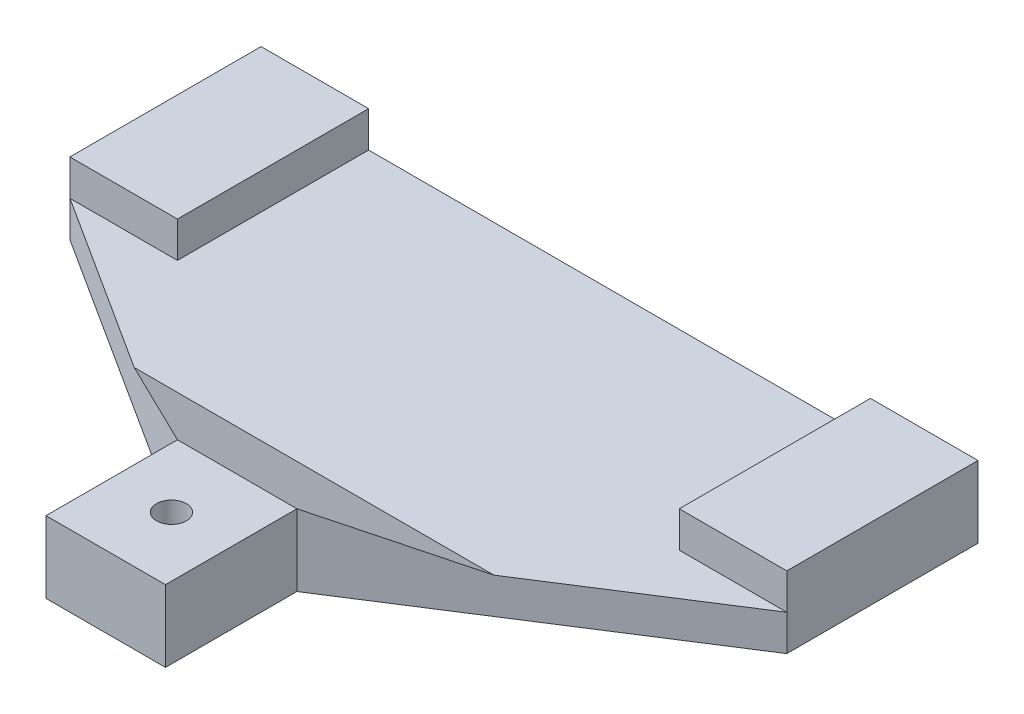
ISO-10303-21;
HEADER;
FILE_DESCRIPTION(('STEP AP214'),'2;1');
FILE_NAME('part.step','',(''),(''),'','','');
FILE_SCHEMA(('AUTOMOTIVE_DESIGN { 1 0 10303 214 1 1 1 1 }'));
ENDSEC;
DATA;
#1=APPLICATION_CONTEXT('core data for automotive mechanical design processes');
#2=APPLICATION_PROTOCOL_DEFINITION('international standard','automotive_design',2000,#1);
#3=PRODUCT_CONTEXT('',#1,'mechanical');
#4=PRODUCT('Part','Part','',(#3));
#5=PRODUCT_RELATED_PRODUCT_CATEGORY('part','',(#4));
#6=PRODUCT_DEFINITION_FORMATION('','',#4);
#7=PRODUCT_DEFINITION_CONTEXT('part definition',#1,'design');
#8=PRODUCT_DEFINITION('design','',#6,#7);
#9=PRODUCT_DEFINITION_SHAPE('','',#8);
#10=(LENGTH_UNIT() NAMED_UNIT(*) SI_UNIT(.MILLI.,.METRE.));
#11=(NAMED_UNIT(*) PLANE_ANGLE_UNIT() SI_UNIT($,.RADIAN.));
#12=(NAMED_UNIT(*) SI_UNIT($,.STERADIAN.) SOLID_ANGLE_UNIT());
#13=UNCERTAINTY_MEASURE_WITH_UNIT(LENGTH_MEASURE(1.E-05),#10,'distance_accuracy_value','');
#14=(GEOMETRIC_REPRESENTATION_CONTEXT(3) GLOBAL_UNCERTAINTY_ASSIGNED_CONTEXT((#13)) GLOBAL_UNIT_ASSIGNED_CONTEXT((#10,
#11,#12)) REPRESENTATION_CONTEXT('',''));
#15=CARTESIAN_POINT('',(0.,0.,0.));
#16=DIRECTION('',(0.,0.,1.));
#17=DIRECTION('',(1.,0.,0.));
#18=AXIS2_PLACEMENT_3D('',#15,#16,#17);
#19=CARTESIAN_POINT('',(0.,6.,60.));
#20=DIRECTION('',(0.,-1.,0.));
#21=DIRECTION('',(0.,0.,-1.));
#22=AXIS2_PLACEMENT_3D('',#19,#20,#21);
#23=PLANE('',#22);
#24=DIRECTION('',(0.,0.,-1.));
#25=VECTOR('',#24,1.);
#26=CARTESIAN_POINT('',(0.,6.,60.));
#27=LINE('',#26,#25);
#28=CARTESIAN_POINT('',(0.,6.,16.));
#29=VERTEX_POINT('',#28);
#30=CARTESIAN_POINT('',(0.,6.,0.));
#31=VERTEX_POINT('',#30);
#32=EDGE_CURVE('E228',#29,#31,#27,.T.);
#33=ORIENTED_EDGE('',*,*,#32,.F.);
#34=DIRECTION('',(-1.,0.,0.));
#35=VECTOR('',#34,1.);
#36=CARTESIAN_POINT('',(0.,6.,16.));
#37=LINE('',#36,#35);
#38=CARTESIAN_POINT('',(9.,6.,16.));
#39=VERTEX_POINT('',#38);
#40=EDGE_CURVE('E164',#39,#29,#37,.T.);
#41=ORIENTED_EDGE('',*,*,#40,.F.);
#42=DIRECTION('',(0.,0.,1.));
#43=VECTOR('',#42,1.);
#44=CARTESIAN_POINT('',(9.,6.,16.));
#45=LINE('',#44,#43);
#46=CARTESIAN_POINT('',(9.,6.,0.));
#47=VERTEX_POINT('',#46);
#48=EDGE_CURVE('E180',#47,#39,#45,.T.);
#49=ORIENTED_EDGE('',*,*,#48,.F.);
#50=DIRECTION('',(-1.,0.,0.));
#51=VECTOR('',#50,1.);
#52=CARTESIAN_POINT('',(0.,6.,0.));
#53=LINE('',#52,#51);
#54=EDGE_CURVE('E224',#47,#31,#53,.T.);
#55=ORIENTED_EDGE('',*,*,#54,.T.);
#56=EDGE_LOOP('',(#33,#41,#49,#55));
#57=FACE_BOUND('',#56,.T.);
#58=ADVANCED_FACE('F33',(#57),#23,.F.);
#59=CARTESIAN_POINT('',(30.,6.,37.5));
#60=DIRECTION('',(0.,1.,0.));
#61=DIRECTION('',(0.,0.,1.));
#62=AXIS2_PLACEMENT_3D('',#59,#60,#61);
#63=CIRCLE('',#62,1.25);
#64=CARTESIAN_POINT('',(30.,6.,38.75));
#65=VERTEX_POINT('',#64);
#66=EDGE_CURVE('E187',#65,#65,#63,.T.);
#67=ORIENTED_EDGE('',*,*,#66,.F.);
#68=EDGE_LOOP('',(#67));
#69=FACE_BOUND('',#68,.T.);
#70=DIRECTION('',(0.,0.,1.));
#71=VECTOR('',#70,1.);
#72=CARTESIAN_POINT('',(25.,6.,32.));
#73=LINE('',#72,#71);
#74=CARTESIAN_POINT('',(25.,5.99999999999999,32.));
#75=VERTEX_POINT('',#74);
#76=CARTESIAN_POINT('',(25.,6.,43.));
#77=VERTEX_POINT('',#76);
#78=EDGE_CURVE('E152',#75,#77,#73,.T.);
#79=ORIENTED_EDGE('',*,*,#78,.T.);
#80=DIRECTION('',(1.,0.,0.));
#81=VECTOR('',#80,1.);
#82=CARTESIAN_POINT('',(25.,6.,43.));
#83=LINE('',#82,#81);
#84=CARTESIAN_POINT('',(35.,6.,43.));
#85=VERTEX_POINT('',#84);
#86=EDGE_CURVE('E137',#77,#85,#83,.T.);
#87=ORIENTED_EDGE('',*,*,#86,.T.);
#88=DIRECTION('',(0.,0.,-1.));
#89=VECTOR('',#88,1.);
#90=CARTESIAN_POINT('',(35.,6.,43.));
#91=LINE('',#90,#89);
#92=CARTESIAN_POINT('',(35.,6.,32.));
#93=VERTEX_POINT('',#92);
#94=EDGE_CURVE('E127',#85,#93,#91,.T.);
#95=ORIENTED_EDGE('',*,*,#94,.T.);
#96=DIRECTION('',(-1.,0.,0.));
#97=VECTOR('',#96,1.);
#98=CARTESIAN_POINT('',(35.,6.,32.));
#99=LINE('',#98,#97);
#100=EDGE_CURVE('E136',#93,#75,#99,.T.);
#101=ORIENTED_EDGE('',*,*,#100,.T.);
#102=EDGE_LOOP('',(#79,#87,#95,#101));
#103=FACE_BOUND('',#102,.T.);
#104=ADVANCED_FACE('F150',(#69,#103),#23,.F.);
#105=CARTESIAN_POINT('',(0.,0.,60.));
#106=DIRECTION('',(1.,0.,0.));
#107=DIRECTION('',(0.,0.,-1.));
#108=AXIS2_PLACEMENT_3D('',#105,#106,#107);
#109=PLANE('',#108);
#110=DIRECTION('',(0.,0.,-1.));
#111=VECTOR('',#110,1.);
#112=CARTESIAN_POINT('',(0.,0.,60.));
#113=LINE('',#112,#111);
#114=CARTESIAN_POINT('',(0.,0.,16.));
#115=VERTEX_POINT('',#114);
#116=CARTESIAN_POINT('',(0.,0.,0.));
#117=VERTEX_POINT('',#116);
#118=EDGE_CURVE('E234',#115,#117,#113,.T.);
#119=ORIENTED_EDGE('',*,*,#118,.F.);
#120=DIRECTION('',(0.,1.,0.));
#121=VECTOR('',#120,1.);
#122=CARTESIAN_POINT('',(0.,-49.,16.));
#123=LINE('',#122,#121);
#124=CARTESIAN_POINT('',(0.,3.,16.));
#125=VERTEX_POINT('',#124);
#126=EDGE_CURVE('E80',#115,#125,#123,.T.);
#127=ORIENTED_EDGE('',*,*,#126,.T.);
#128=DIRECTION('',(0.,1.,0.));
#129=VECTOR('',#128,1.);
#130=CARTESIAN_POINT('',(0.,3.,16.));
#131=LINE('',#130,#129);
#132=EDGE_CURVE('E184',#125,#29,#131,.T.);
#133=ORIENTED_EDGE('',*,*,#132,.T.);
#134=ORIENTED_EDGE('',*,*,#32,.T.);
#135=DIRECTION('',(0.,-1.,0.));
#136=VECTOR('',#135,1.);
#137=CARTESIAN_POINT('',(0.,0.,0.));
#138=LINE('',#137,#136);
#139=EDGE_CURVE('E213',#31,#117,#138,.T.);
#140=ORIENTED_EDGE('',*,*,#139,.T.);
#141=EDGE_LOOP('',(#119,#127,#133,#134,#140));
#142=FACE_BOUND('',#141,.T.);
#143=ADVANCED_FACE('F275',(#142),#109,.F.);
#144=CARTESIAN_POINT('',(0.,0.,60.));
#145=DIRECTION('',(0.,1.,0.));
#146=DIRECTION('',(0.,0.,1.));
#147=AXIS2_PLACEMENT_3D('',#144,#145,#146);
#148=PLANE('',#147);
#149=CARTESIAN_POINT('',(30.,0.,37.5));
#150=DIRECTION('',(0.,1.,0.));
#151=DIRECTION('',(0.,0.,1.));
#152=AXIS2_PLACEMENT_3D('',#149,#150,#151);
#153=CIRCLE('',#152,1.25);
#154=CARTESIAN_POINT('',(30.,0.,38.75));
#155=VERTEX_POINT('',#154);
#156=EDGE_CURVE('E200',#155,#155,#153,.T.);
#157=ORIENTED_EDGE('',*,*,#156,.T.);
#158=EDGE_LOOP('',(#157));
#159=FACE_BOUND('',#158,.T.);
#160=DIRECTION('',(0.,0.,-1.));
#161=VECTOR('',#160,1.);
#162=CARTESIAN_POINT('',(25.,0.,60.));
#163=LINE('',#162,#161);
#164=CARTESIAN_POINT('',(25.,0.,43.));
#165=VERTEX_POINT('',#164);
#166=CARTESIAN_POINT('',(25.,0.,32.));
#167=VERTEX_POINT('',#166);
#168=EDGE_CURVE('E267',#165,#167,#163,.T.);
#169=ORIENTED_EDGE('',*,*,#168,.T.);
#170=DIRECTION('',(-0.842271400661512,0.,-0.539053696423367));
#171=VECTOR('',#170,1.);
#172=CARTESIAN_POINT('',(19.9772985244041,0.,28.7854710556186));
#173=LINE('',#172,#171);
#174=EDGE_CURVE('E154',#167,#115,#173,.T.);
#175=ORIENTED_EDGE('',*,*,#174,.T.);
#176=ORIENTED_EDGE('',*,*,#118,.T.);
#177=DIRECTION('',(1.,0.,0.));
#178=VECTOR('',#177,1.);
#179=CARTESIAN_POINT('',(0.,0.,0.));
#180=LINE('',#179,#178);
#181=CARTESIAN_POINT('',(60.,0.,0.));
#182=VERTEX_POINT('',#181);
#183=EDGE_CURVE('E218',#117,#182,#180,.T.);
#184=ORIENTED_EDGE('',*,*,#183,.T.);
#185=DIRECTION('',(0.,0.,-1.));
#186=VECTOR('',#185,1.);
#187=CARTESIAN_POINT('',(60.,0.,60.));
#188=LINE('',#187,#186);
#189=CARTESIAN_POINT('',(60.,0.,16.));
#190=VERTEX_POINT('',#189);
#191=EDGE_CURVE('E232',#190,#182,#188,.T.);
#192=ORIENTED_EDGE('',*,*,#191,.F.);
#193=DIRECTION('',(-0.842271400661512,0.,0.539053696423367));
#194=VECTOR('',#193,1.);
#195=CARTESIAN_POINT('',(-2.54256526674234,0.,56.0272417707151));
#196=LINE('',#195,#194);
#197=CARTESIAN_POINT('',(35.,0.,32.));
#198=VERTEX_POINT('',#197);
#199=EDGE_CURVE('E259',#190,#198,#196,.T.);
#200=ORIENTED_EDGE('',*,*,#199,.T.);
#201=DIRECTION('',(0.,0.,1.));
#202=VECTOR('',#201,1.);
#203=CARTESIAN_POINT('',(35.,0.,60.));
#204=LINE('',#203,#202);
#205=CARTESIAN_POINT('',(35.,0.,43.));
#206=VERTEX_POINT('',#205);
#207=EDGE_CURVE('E264',#198,#206,#204,.T.);
#208=ORIENTED_EDGE('',*,*,#207,.T.);
#209=DIRECTION('',(-1.,0.,0.));
#210=VECTOR('',#209,1.);
#211=CARTESIAN_POINT('',(0.,0.,43.));
#212=LINE('',#211,#210);
#213=EDGE_CURVE('E145',#206,#165,#212,.T.);
#214=ORIENTED_EDGE('',*,*,#213,.T.);
#215=EDGE_LOOP('',(#169,#175,#176,#184,#192,#200,#208,#214));
#216=FACE_BOUND('',#215,.T.);
#217=ADVANCED_FACE('F271',(#159,#216),#148,.F.);
#218=CARTESIAN_POINT('',(60.,0.,60.));
#219=DIRECTION('',(-1.,0.,0.));
#220=DIRECTION('',(0.,0.,1.));
#221=AXIS2_PLACEMENT_3D('',#218,#219,#220);
#222=PLANE('',#221);
#223=DIRECTION('',(0.,1.,0.));
#224=VECTOR('',#223,1.);
#225=CARTESIAN_POINT('',(60.,3.,16.));
#226=LINE('',#225,#224);
#227=CARTESIAN_POINT('',(60.,3.,16.));
#228=VERTEX_POINT('',#227);
#229=CARTESIAN_POINT('',(60.,6.,16.));
#230=VERTEX_POINT('',#229);
#231=EDGE_CURVE('E175',#228,#230,#226,.T.);
#232=ORIENTED_EDGE('',*,*,#231,.F.);
#233=DIRECTION('',(0.,1.,0.));
#234=VECTOR('',#233,1.);
#235=CARTESIAN_POINT('',(60.,-49.,16.));
#236=LINE('',#235,#234);
#237=EDGE_CURVE('E243',#190,#228,#236,.T.);
#238=ORIENTED_EDGE('',*,*,#237,.F.);
#239=ORIENTED_EDGE('',*,*,#191,.T.);
#240=DIRECTION('',(0.,1.,0.));
#241=VECTOR('',#240,1.);
#242=CARTESIAN_POINT('',(60.,0.,0.));
#243=LINE('',#242,#241);
#244=CARTESIAN_POINT('',(60.,6.,0.));
#245=VERTEX_POINT('',#244);
#246=EDGE_CURVE('E221',#182,#245,#243,.T.);
#247=ORIENTED_EDGE('',*,*,#246,.T.);
#248=DIRECTION('',(0.,0.,-1.));
#249=VECTOR('',#248,1.);
#250=CARTESIAN_POINT('',(60.,6.,60.));
#251=LINE('',#250,#249);
#252=EDGE_CURVE('E230',#230,#245,#251,.T.);
#253=ORIENTED_EDGE('',*,*,#252,.F.);
#254=EDGE_LOOP('',(#232,#238,#239,#247,#253));
#255=FACE_BOUND('',#254,.T.);
#256=ADVANCED_FACE('F292',(#255),#222,.F.);
#257=CARTESIAN_POINT('',(51.,6.,0.));
#258=VERTEX_POINT('',#257);
#259=EDGE_CURVE('E225',#245,#258,#53,.T.);
#260=ORIENTED_EDGE('',*,*,#259,.T.);
#261=DIRECTION('',(0.,0.,-1.));
#262=VECTOR('',#261,1.);
#263=CARTESIAN_POINT('',(51.,6.,0.));
#264=LINE('',#263,#262);
#265=CARTESIAN_POINT('',(51.,6.,16.));
#266=VERTEX_POINT('',#265);
#267=EDGE_CURVE('E178',#266,#258,#264,.T.);
#268=ORIENTED_EDGE('',*,*,#267,.F.);
#269=DIRECTION('',(-1.,0.,0.));
#270=VECTOR('',#269,1.);
#271=CARTESIAN_POINT('',(51.,6.,16.));
#272=LINE('',#271,#270);
#273=EDGE_CURVE('E147',#230,#266,#272,.T.);
#274=ORIENTED_EDGE('',*,*,#273,.F.);
#275=ORIENTED_EDGE('',*,*,#252,.T.);
#276=EDGE_LOOP('',(#260,#268,#274,#275));
#277=FACE_BOUND('',#276,.T.);
#278=ADVANCED_FACE('F300',(#277),#23,.F.);
#279=CARTESIAN_POINT('',(0.,0.,0.));
#280=DIRECTION('',(0.,0.,-1.));
#281=DIRECTION('',(-1.,0.,0.));
#282=AXIS2_PLACEMENT_3D('',#279,#280,#281);
#283=PLANE('',#282);
#284=DIRECTION('',(0.,1.,0.));
#285=VECTOR('',#284,1.);
#286=CARTESIAN_POINT('',(9.,3.,0.));
#287=LINE('',#286,#285);
#288=CARTESIAN_POINT('',(9.,3.,0.));
#289=VERTEX_POINT('',#288);
#290=EDGE_CURVE('E190',#289,#47,#287,.T.);
#291=ORIENTED_EDGE('',*,*,#290,.F.);
#292=DIRECTION('',(-1.,0.,0.));
#293=VECTOR('',#292,1.);
#294=CARTESIAN_POINT('',(9.,3.,0.));
#295=LINE('',#294,#293);
#296=CARTESIAN_POINT('',(51.,3.,0.));
#297=VERTEX_POINT('',#296);
#298=EDGE_CURVE('E166',#297,#289,#295,.T.);
#299=ORIENTED_EDGE('',*,*,#298,.F.);
#300=DIRECTION('',(0.,1.,0.));
#301=VECTOR('',#300,1.);
#302=CARTESIAN_POINT('',(51.,3.,0.));
#303=LINE('',#302,#301);
#304=EDGE_CURVE('E192',#297,#258,#303,.T.);
#305=ORIENTED_EDGE('',*,*,#304,.T.);
#306=ORIENTED_EDGE('',*,*,#259,.F.);
#307=ORIENTED_EDGE('',*,*,#246,.F.);
#308=ORIENTED_EDGE('',*,*,#183,.F.);
#309=ORIENTED_EDGE('',*,*,#139,.F.);
#310=ORIENTED_EDGE('',*,*,#54,.F.);
#311=EDGE_LOOP('',(#291,#299,#305,#306,#307,#308,#309,#310));
#312=FACE_BOUND('',#311,.T.);
#313=CARTESIAN_POINT('',(5.75,3.,0.));
#314=DIRECTION('',(0.,0.,-1.));
#315=DIRECTION('',(-1.,0.,0.));
#316=AXIS2_PLACEMENT_3D('',#313,#314,#315);
#317=CIRCLE('',#316,1.25);
#318=CARTESIAN_POINT('',(4.5,3.,0.));
#319=VERTEX_POINT('',#318);
#320=EDGE_CURVE('E203',#319,#319,#317,.T.);
#321=ORIENTED_EDGE('',*,*,#320,.F.);
#322=EDGE_LOOP('',(#321));
#323=FACE_BOUND('',#322,.T.);
#324=CARTESIAN_POINT('',(54.,3.,0.));
#325=DIRECTION('',(0.,0.,-1.));
#326=DIRECTION('',(-1.,0.,0.));
#327=AXIS2_PLACEMENT_3D('',#324,#325,#326);
#328=CIRCLE('',#327,1.25);
#329=CARTESIAN_POINT('',(52.75,3.,0.));
#330=VERTEX_POINT('',#329);
#331=EDGE_CURVE('E207',#330,#330,#328,.T.);
#332=ORIENTED_EDGE('',*,*,#331,.F.);
#333=EDGE_LOOP('',(#332));
#334=FACE_BOUND('',#333,.T.);
#335=ADVANCED_FACE('F283',(#312,#323,#334),#283,.T.);
#336=CARTESIAN_POINT('',(54.,3.,15.));
#337=DIRECTION('',(0.,0.,-1.));
#338=DIRECTION('',(-1.,0.,0.));
#339=AXIS2_PLACEMENT_3D('',#336,#337,#338);
#340=CYLINDRICAL_SURFACE('',#339,1.25);
#341=CARTESIAN_POINT('',(54.,3.,15.));
#342=DIRECTION('',(0.,0.,-1.));
#343=DIRECTION('',(-1.,0.,0.));
#344=AXIS2_PLACEMENT_3D('',#341,#342,#343);
#345=CIRCLE('',#344,1.25);
#346=CARTESIAN_POINT('',(52.75,3.,15.));
#347=VERTEX_POINT('',#346);
#348=EDGE_CURVE('E210',#347,#347,#345,.T.);
#349=ORIENTED_EDGE('',*,*,#348,.F.);
#350=EDGE_LOOP('',(#349));
#351=FACE_BOUND('',#350,.T.);
#352=ORIENTED_EDGE('',*,*,#331,.T.);
#353=EDGE_LOOP('',(#352));
#354=FACE_BOUND('',#353,.T.);
#355=ADVANCED_FACE('F336',(#351,#354),#340,.F.);
#356=CARTESIAN_POINT('',(54.,3.,15.));
#357=DIRECTION('',(0.,0.,-1.));
#358=DIRECTION('',(-1.,0.,0.));
#359=AXIS2_PLACEMENT_3D('',#356,#357,#358);
#360=PLANE('',#359);
#361=ORIENTED_EDGE('',*,*,#348,.T.);
#362=EDGE_LOOP('',(#361));
#363=FACE_BOUND('',#362,.T.);
#364=ADVANCED_FACE('F482',(#363),#360,.T.);
#365=CARTESIAN_POINT('',(5.75,3.,15.));
#366=DIRECTION('',(0.,0.,-1.));
#367=DIRECTION('',(-1.,0.,0.));
#368=AXIS2_PLACEMENT_3D('',#365,#366,#367);
#369=CYLINDRICAL_SURFACE('',#368,1.25);
#370=CARTESIAN_POINT('',(5.75,3.,15.));
#371=DIRECTION('',(0.,0.,-1.));
#372=DIRECTION('',(-1.,0.,0.));
#373=AXIS2_PLACEMENT_3D('',#370,#371,#372);
#374=CIRCLE('',#373,1.25);
#375=CARTESIAN_POINT('',(4.5,3.,15.));
#376=VERTEX_POINT('',#375);
#377=EDGE_CURVE('E204',#376,#376,#374,.T.);
#378=ORIENTED_EDGE('',*,*,#377,.F.);
#379=EDGE_LOOP('',(#378));
#380=FACE_BOUND('',#379,.T.);
#381=ORIENTED_EDGE('',*,*,#320,.T.);
#382=EDGE_LOOP('',(#381));
#383=FACE_BOUND('',#382,.T.);
#384=ADVANCED_FACE('F489',(#380,#383),#369,.F.);
#385=CARTESIAN_POINT('',(5.75,3.,15.));
#386=DIRECTION('',(0.,0.,-1.));
#387=DIRECTION('',(-1.,0.,0.));
#388=AXIS2_PLACEMENT_3D('',#385,#386,#387);
#389=PLANE('',#388);
#390=ORIENTED_EDGE('',*,*,#377,.T.);
#391=EDGE_LOOP('',(#390));
#392=FACE_BOUND('',#391,.T.);
#393=ADVANCED_FACE('F497',(#392),#389,.T.);
#394=CARTESIAN_POINT('',(30.,-9.,37.5));
#395=DIRECTION('',(0.,1.,0.));
#396=DIRECTION('',(0.,0.,1.));
#397=AXIS2_PLACEMENT_3D('',#394,#395,#396);
#398=CYLINDRICAL_SURFACE('',#397,1.25);
#399=ORIENTED_EDGE('',*,*,#66,.T.);
#400=EDGE_LOOP('',(#399));
#401=FACE_BOUND('',#400,.T.);
#402=ORIENTED_EDGE('',*,*,#156,.F.);
#403=EDGE_LOOP('',(#402));
#404=FACE_BOUND('',#403,.T.);
#405=ADVANCED_FACE('F321',(#401,#404),#398,.F.);
#406=CARTESIAN_POINT('',(0.,3.,16.));
#407=DIRECTION('',(0.,0.,-1.));
#408=DIRECTION('',(-1.,0.,0.));
#409=AXIS2_PLACEMENT_3D('',#406,#407,#408);
#410=PLANE('',#409);
#411=ORIENTED_EDGE('',*,*,#40,.T.);
#412=ORIENTED_EDGE('',*,*,#132,.F.);
#413=DIRECTION('',(-1.,0.,0.));
#414=VECTOR('',#413,1.);
#415=CARTESIAN_POINT('',(0.,3.,16.));
#416=LINE('',#415,#414);
#417=CARTESIAN_POINT('',(9.,3.,16.));
#418=VERTEX_POINT('',#417);
#419=EDGE_CURVE('E172',#418,#125,#416,.T.);
#420=ORIENTED_EDGE('',*,*,#419,.F.);
#421=DIRECTION('',(0.,1.,0.));
#422=VECTOR('',#421,1.);
#423=CARTESIAN_POINT('',(9.,3.,16.));
#424=LINE('',#423,#422);
#425=EDGE_CURVE('E188',#418,#39,#424,.T.);
#426=ORIENTED_EDGE('',*,*,#425,.T.);
#427=EDGE_LOOP('',(#411,#412,#420,#426));
#428=FACE_BOUND('',#427,.T.);
#429=ADVANCED_FACE('F308',(#428),#410,.F.);
#430=CARTESIAN_POINT('',(9.,3.,16.));
#431=DIRECTION('',(-1.,0.,0.));
#432=DIRECTION('',(0.,0.,1.));
#433=AXIS2_PLACEMENT_3D('',#430,#431,#432);
#434=PLANE('',#433);
#435=ORIENTED_EDGE('',*,*,#48,.T.);
#436=ORIENTED_EDGE('',*,*,#425,.F.);
#437=DIRECTION('',(0.,0.,1.));
#438=VECTOR('',#437,1.);
#439=CARTESIAN_POINT('',(9.,3.,16.));
#440=LINE('',#439,#438);
#441=EDGE_CURVE('E169',#289,#418,#440,.T.);
#442=ORIENTED_EDGE('',*,*,#441,.F.);
#443=ORIENTED_EDGE('',*,*,#290,.T.);
#444=EDGE_LOOP('',(#435,#436,#442,#443));
#445=FACE_BOUND('',#444,.T.);
#446=ADVANCED_FACE('F313',(#445),#434,.F.);
#447=CARTESIAN_POINT('',(51.,3.,0.));
#448=DIRECTION('',(1.,0.,0.));
#449=DIRECTION('',(0.,0.,-1.));
#450=AXIS2_PLACEMENT_3D('',#447,#448,#449);
#451=PLANE('',#450);
#452=ORIENTED_EDGE('',*,*,#267,.T.);
#453=ORIENTED_EDGE('',*,*,#304,.F.);
#454=DIRECTION('',(0.,0.,-1.));
#455=VECTOR('',#454,1.);
#456=CARTESIAN_POINT('',(51.,3.,0.));
#457=LINE('',#456,#455);
#458=CARTESIAN_POINT('',(51.,3.,16.));
#459=VERTEX_POINT('',#458);
#460=EDGE_CURVE('E163',#459,#297,#457,.T.);
#461=ORIENTED_EDGE('',*,*,#460,.F.);
#462=DIRECTION('',(0.,1.,0.));
#463=VECTOR('',#462,1.);
#464=CARTESIAN_POINT('',(51.,3.,16.));
#465=LINE('',#464,#463);
#466=EDGE_CURVE('E195',#459,#266,#465,.T.);
#467=ORIENTED_EDGE('',*,*,#466,.T.);
#468=EDGE_LOOP('',(#452,#453,#461,#467));
#469=FACE_BOUND('',#468,.T.);
#470=ADVANCED_FACE('F303',(#469),#451,.F.);
#471=CARTESIAN_POINT('',(51.,3.,16.));
#472=DIRECTION('',(0.,0.,-1.));
#473=DIRECTION('',(-1.,0.,0.));
#474=AXIS2_PLACEMENT_3D('',#471,#472,#473);
#475=PLANE('',#474);
#476=ORIENTED_EDGE('',*,*,#273,.T.);
#477=ORIENTED_EDGE('',*,*,#466,.F.);
#478=DIRECTION('',(-1.,0.,0.));
#479=VECTOR('',#478,1.);
#480=CARTESIAN_POINT('',(51.,3.,16.));
#481=LINE('',#480,#479);
#482=EDGE_CURVE('E160',#228,#459,#481,.T.);
#483=ORIENTED_EDGE('',*,*,#482,.F.);
#484=ORIENTED_EDGE('',*,*,#231,.T.);
#485=EDGE_LOOP('',(#476,#477,#483,#484));
#486=FACE_BOUND('',#485,.T.);
#487=ADVANCED_FACE('F297',(#486),#475,.F.);
#488=CARTESIAN_POINT('',(0.,3.,0.));
#489=DIRECTION('',(0.,-1.,0.));
#490=DIRECTION('',(0.,0.,-1.));
#491=AXIS2_PLACEMENT_3D('',#488,#489,#490);
#492=PLANE('',#491);
#493=DIRECTION('',(-0.842271400661512,0.,-0.539053696423367));
#494=VECTOR('',#493,1.);
#495=CARTESIAN_POINT('',(25.,3.,32.));
#496=LINE('',#495,#494);
#497=CARTESIAN_POINT('',(14.9476238101113,3.,25.5664792384712));
#498=VERTEX_POINT('',#497);
#499=EDGE_CURVE('E238',#498,#125,#496,.T.);
#500=ORIENTED_EDGE('',*,*,#499,.F.);
#501=DIRECTION('',(1.,0.,0.));
#502=VECTOR('',#501,1.);
#503=CARTESIAN_POINT('',(0.,3.,25.5664792384712));
#504=LINE('',#503,#502);
#505=CARTESIAN_POINT('',(45.0523761898887,3.,25.5664792384712));
#506=VERTEX_POINT('',#505);
#507=EDGE_CURVE('E57',#498,#506,#504,.T.);
#508=ORIENTED_EDGE('',*,*,#507,.T.);
#509=DIRECTION('',(-0.842271400661512,0.,0.539053696423367));
#510=VECTOR('',#509,1.);
#511=CARTESIAN_POINT('',(60.,3.,16.));
#512=LINE('',#511,#510);
#513=EDGE_CURVE('E244',#228,#506,#512,.T.);
#514=ORIENTED_EDGE('',*,*,#513,.F.);
#515=ORIENTED_EDGE('',*,*,#482,.T.);
#516=ORIENTED_EDGE('',*,*,#460,.T.);
#517=ORIENTED_EDGE('',*,*,#298,.T.);
#518=ORIENTED_EDGE('',*,*,#441,.T.);
#519=ORIENTED_EDGE('',*,*,#419,.T.);
#520=EDGE_LOOP('',(#500,#508,#514,#515,#516,#517,#518,#519));
#521=FACE_BOUND('',#520,.T.);
#522=ADVANCED_FACE('F241',(#521),#492,.F.);
#523=CARTESIAN_POINT('',(25.,3.,32.));
#524=DIRECTION('',(-1.,0.,0.));
#525=DIRECTION('',(0.,0.,1.));
#526=AXIS2_PLACEMENT_3D('',#523,#524,#525);
#527=PLANE('',#526);
#528=ORIENTED_EDGE('',*,*,#78,.F.);
#529=DIRECTION('',(0.,1.,0.));
#530=VECTOR('',#529,1.);
#531=CARTESIAN_POINT('',(25.,-49.,32.));
#532=LINE('',#531,#530);
#533=EDGE_CURVE('E70',#167,#75,#532,.T.);
#534=ORIENTED_EDGE('',*,*,#533,.F.);
#535=ORIENTED_EDGE('',*,*,#168,.F.);
#536=DIRECTION('',(0.,1.,0.));
#537=VECTOR('',#536,1.);
#538=CARTESIAN_POINT('',(25.,3.,43.));
#539=LINE('',#538,#537);
#540=EDGE_CURVE('E148',#165,#77,#539,.T.);
#541=ORIENTED_EDGE('',*,*,#540,.T.);
#542=EDGE_LOOP('',(#528,#534,#535,#541));
#543=FACE_BOUND('',#542,.T.);
#544=ADVANCED_FACE('F402',(#543),#527,.T.);
#545=CARTESIAN_POINT('',(35.,3.,43.));
#546=DIRECTION('',(1.,0.,0.));
#547=DIRECTION('',(0.,0.,-1.));
#548=AXIS2_PLACEMENT_3D('',#545,#546,#547);
#549=PLANE('',#548);
#550=ORIENTED_EDGE('',*,*,#94,.F.);
#551=DIRECTION('',(0.,1.,0.));
#552=VECTOR('',#551,1.);
#553=CARTESIAN_POINT('',(35.,3.,43.));
#554=LINE('',#553,#552);
#555=EDGE_CURVE('E131',#206,#85,#554,.T.);
#556=ORIENTED_EDGE('',*,*,#555,.F.);
#557=ORIENTED_EDGE('',*,*,#207,.F.);
#558=DIRECTION('',(0.,1.,0.));
#559=VECTOR('',#558,1.);
#560=CARTESIAN_POINT('',(35.,-49.,32.));
#561=LINE('',#560,#559);
#562=EDGE_CURVE('E48',#198,#93,#561,.T.);
#563=ORIENTED_EDGE('',*,*,#562,.T.);
#564=EDGE_LOOP('',(#550,#556,#557,#563));
#565=FACE_BOUND('',#564,.T.);
#566=ADVANCED_FACE('F129',(#565),#549,.T.);
#567=CARTESIAN_POINT('',(25.,3.,43.));
#568=DIRECTION('',(0.,0.,1.));
#569=DIRECTION('',(1.,0.,0.));
#570=AXIS2_PLACEMENT_3D('',#567,#568,#569);
#571=PLANE('',#570);
#572=ORIENTED_EDGE('',*,*,#86,.F.);
#573=ORIENTED_EDGE('',*,*,#540,.F.);
#574=ORIENTED_EDGE('',*,*,#213,.F.);
#575=ORIENTED_EDGE('',*,*,#555,.T.);
#576=EDGE_LOOP('',(#572,#573,#574,#575));
#577=FACE_BOUND('',#576,.T.);
#578=ADVANCED_FACE('F141',(#577),#571,.T.);
#579=CARTESIAN_POINT('',(25.,-49.,32.));
#580=DIRECTION('',(0.539053696423367,0.,-0.842271400661512));
#581=DIRECTION('',(-0.842271400661512,0.,-0.539053696423367));
#582=AXIS2_PLACEMENT_3D('',#579,#580,#581);
#583=PLANE('',#582);
#584=ORIENTED_EDGE('',*,*,#533,.T.);
#585=DIRECTION('',(-0.816860277986021,-0.243781250091197,-0.522790577911053));
#586=VECTOR('',#585,1.);
#587=CARTESIAN_POINT('',(14.0475629155499,2.73138861571853,24.9904402659519));
#588=LINE('',#587,#586);
#589=EDGE_CURVE('E41',#75,#498,#588,.T.);
#590=ORIENTED_EDGE('',*,*,#589,.T.);
#591=ORIENTED_EDGE('',*,*,#499,.T.);
#592=ORIENTED_EDGE('',*,*,#126,.F.);
#593=ORIENTED_EDGE('',*,*,#174,.F.);
#594=EDGE_LOOP('',(#584,#590,#591,#592,#593));
#595=FACE_BOUND('',#594,.T.);
#596=ADVANCED_FACE('F236',(#595),#583,.F.);
#597=CARTESIAN_POINT('',(60.,-49.,16.));
#598=DIRECTION('',(-0.539053696423367,0.,-0.842271400661512));
#599=DIRECTION('',(-0.842271400661512,0.,0.539053696423367));
#600=AXIS2_PLACEMENT_3D('',#597,#598,#599);
#601=PLANE('',#600);
#602=ORIENTED_EDGE('',*,*,#237,.T.);
#603=ORIENTED_EDGE('',*,*,#513,.T.);
#604=DIRECTION('',(-0.816860277986021,0.243781250091197,0.522790577911053));
#605=VECTOR('',#604,1.);
#606=CARTESIAN_POINT('',(69.4667046370494,-4.28613652711823,9.94130903228836));
#607=LINE('',#606,#605);
#608=EDGE_CURVE('E11',#506,#93,#607,.T.);
#609=ORIENTED_EDGE('',*,*,#608,.T.);
#610=ORIENTED_EDGE('',*,*,#562,.F.);
#611=ORIENTED_EDGE('',*,*,#199,.F.);
#612=EDGE_LOOP('',(#602,#603,#609,#610,#611));
#613=FACE_BOUND('',#612,.T.);
#614=ADVANCED_FACE('F249',(#613),#601,.F.);
#615=CARTESIAN_POINT('',(35.,5.99999999999999,32.));
#616=DIRECTION('',(0.,-0.906307787036653,0.422618261740692));
#617=DIRECTION('',(-1.,0.,0.));
#618=AXIS2_PLACEMENT_3D('',#615,#616,#617);
#619=PLANE('',#618);
#620=ORIENTED_EDGE('',*,*,#608,.F.);
#621=ORIENTED_EDGE('',*,*,#507,.F.);
#622=ORIENTED_EDGE('',*,*,#589,.F.);
#623=ORIENTED_EDGE('',*,*,#100,.F.);
#624=EDGE_LOOP('',(#620,#621,#622,#623));
#625=FACE_BOUND('',#624,.T.);
#626=ADVANCED_FACE('F35',(#625),#619,.F.);
#627=CLOSED_SHELL('',(#58,#104,#143,#217,#256,#278,#335,#355,#364,#384,#393,#405,#429,#446,#470,
#487,#522,#544,#566,#578,#596,#614,#626));
#628=MANIFOLD_SOLID_BREP('B2',#627);
#629=ADVANCED_BREP_SHAPE_REPRESENTATION('',(#18,#628),#14);
#630=SHAPE_DEFINITION_REPRESENTATION(#9,#629);
ENDSEC;
END-ISO-10303-21;
